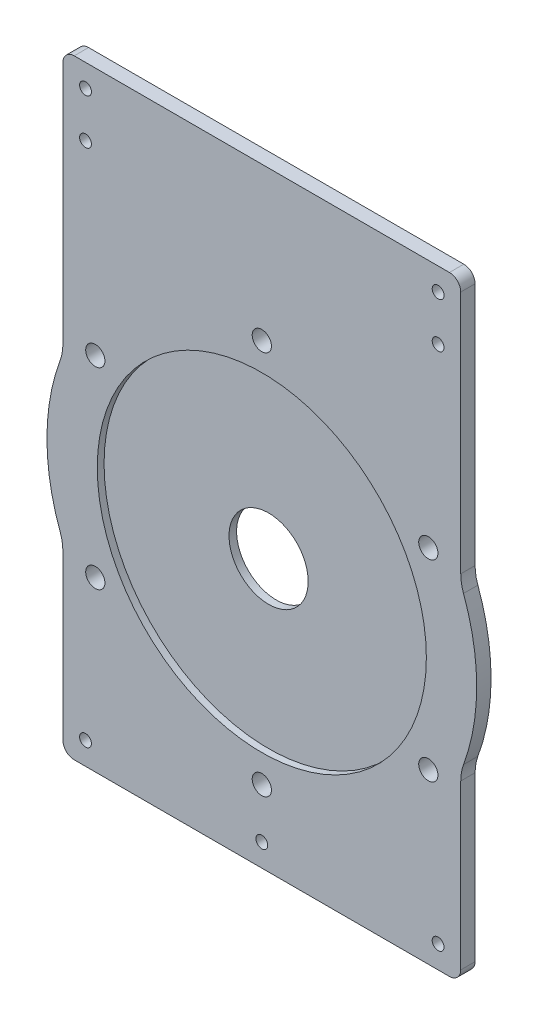
ISO-10303-21;
HEADER;
FILE_DESCRIPTION(('STEP AP214'),'2;1');
FILE_NAME('part.step','',(''),(''),'','','');
FILE_SCHEMA(('AUTOMOTIVE_DESIGN { 1 0 10303 214 1 1 1 1 }'));
ENDSEC;
DATA;
#1=APPLICATION_CONTEXT('core data for automotive mechanical design processes');
#2=APPLICATION_PROTOCOL_DEFINITION('international standard','automotive_design',2000,#1);
#3=PRODUCT_CONTEXT('',#1,'mechanical');
#4=PRODUCT('Part','Part','',(#3));
#5=PRODUCT_RELATED_PRODUCT_CATEGORY('part','',(#4));
#6=PRODUCT_DEFINITION_FORMATION('','',#4);
#7=PRODUCT_DEFINITION_CONTEXT('part definition',#1,'design');
#8=PRODUCT_DEFINITION('design','',#6,#7);
#9=PRODUCT_DEFINITION_SHAPE('','',#8);
#10=(LENGTH_UNIT() NAMED_UNIT(*) SI_UNIT(.MILLI.,.METRE.));
#11=(NAMED_UNIT(*) PLANE_ANGLE_UNIT() SI_UNIT($,.RADIAN.));
#12=(NAMED_UNIT(*) SI_UNIT($,.STERADIAN.) SOLID_ANGLE_UNIT());
#13=UNCERTAINTY_MEASURE_WITH_UNIT(LENGTH_MEASURE(1.E-05),#10,'distance_accuracy_value','');
#14=(GEOMETRIC_REPRESENTATION_CONTEXT(3) GLOBAL_UNCERTAINTY_ASSIGNED_CONTEXT((#13)) GLOBAL_UNIT_ASSIGNED_CONTEXT((#10,
#11,#12)) REPRESENTATION_CONTEXT('',''));
#15=CARTESIAN_POINT('',(0.,0.,0.));
#16=DIRECTION('',(0.,0.,1.));
#17=DIRECTION('',(1.,0.,0.));
#18=AXIS2_PLACEMENT_3D('',#15,#16,#17);
#19=CARTESIAN_POINT('',(0.,0.,6.35));
#20=DIRECTION('',(0.,0.,-1.));
#21=DIRECTION('',(-1.,0.,0.));
#22=AXIS2_PLACEMENT_3D('',#19,#20,#21);
#23=CYLINDRICAL_SURFACE('',#22,95.);
#24=CARTESIAN_POINT('',(0.,0.,6.35));
#25=DIRECTION('',(0.,0.,1.));
#26=DIRECTION('',(1.,0.,0.));
#27=AXIS2_PLACEMENT_3D('',#24,#25,#26);
#28=CIRCLE('',#27,95.);
#29=CARTESIAN_POINT('',(-89.1727826086956,32.759957903244,6.35));
#30=VERTEX_POINT('',#29);
#31=CARTESIAN_POINT('',(-89.1727826086956,-32.7599579032439,6.35));
#32=VERTEX_POINT('',#31);
#33=EDGE_CURVE('E238',#30,#32,#28,.T.);
#34=ORIENTED_EDGE('',*,*,#33,.F.);
#35=DIRECTION('',(0.,0.,-1.));
#36=VECTOR('',#35,1.);
#37=CARTESIAN_POINT('',(-89.1727826086956,32.759957903244,6.35));
#38=LINE('',#37,#36);
#39=CARTESIAN_POINT('',(-89.1727826086956,32.759957903244,0.));
#40=VERTEX_POINT('',#39);
#41=EDGE_CURVE('E234',#30,#40,#38,.T.);
#42=ORIENTED_EDGE('',*,*,#41,.T.);
#43=CARTESIAN_POINT('',(0.,0.,0.));
#44=DIRECTION('',(0.,0.,1.));
#45=DIRECTION('',(1.,0.,0.));
#46=AXIS2_PLACEMENT_3D('',#43,#44,#45);
#47=CIRCLE('',#46,95.);
#48=CARTESIAN_POINT('',(-89.1727826086956,-32.7599579032439,0.));
#49=VERTEX_POINT('',#48);
#50=EDGE_CURVE('E206',#40,#49,#47,.T.);
#51=ORIENTED_EDGE('',*,*,#50,.T.);
#52=DIRECTION('',(0.,0.,-1.));
#53=VECTOR('',#52,1.);
#54=CARTESIAN_POINT('',(-89.1727826086957,-32.7599579032439,6.35));
#55=LINE('',#54,#53);
#56=EDGE_CURVE('E227',#49,#32,#55,.F.);
#57=ORIENTED_EDGE('',*,*,#56,.T.);
#58=EDGE_LOOP('',(#34,#42,#51,#57));
#59=FACE_BOUND('',#58,.T.);
#60=ADVANCED_FACE('F59',(#59),#23,.T.);
#61=CARTESIAN_POINT('',(89.1727826086956,-32.7599579032439,6.35));
#62=VERTEX_POINT('',#61);
#63=CARTESIAN_POINT('',(89.1727826086957,32.7599579032439,6.35));
#64=VERTEX_POINT('',#63);
#65=EDGE_CURVE('E228',#62,#64,#28,.T.);
#66=ORIENTED_EDGE('',*,*,#65,.F.);
#67=DIRECTION('',(0.,0.,-1.));
#68=VECTOR('',#67,1.);
#69=CARTESIAN_POINT('',(89.1727826086957,-32.7599579032439,6.35));
#70=LINE('',#69,#68);
#71=CARTESIAN_POINT('',(89.1727826086956,-32.7599579032439,0.));
#72=VERTEX_POINT('',#71);
#73=EDGE_CURVE('E257',#62,#72,#70,.T.);
#74=ORIENTED_EDGE('',*,*,#73,.T.);
#75=CARTESIAN_POINT('',(89.1727826086957,32.7599579032439,0.));
#76=VERTEX_POINT('',#75);
#77=EDGE_CURVE('E241',#72,#76,#47,.T.);
#78=ORIENTED_EDGE('',*,*,#77,.T.);
#79=DIRECTION('',(0.,0.,-1.));
#80=VECTOR('',#79,1.);
#81=CARTESIAN_POINT('',(89.1727826086957,32.7599579032439,6.35));
#82=LINE('',#81,#80);
#83=EDGE_CURVE('E253',#76,#64,#82,.F.);
#84=ORIENTED_EDGE('',*,*,#83,.T.);
#85=EDGE_LOOP('',(#66,#74,#78,#84));
#86=FACE_BOUND('',#85,.T.);
#87=ADVANCED_FACE('F490',(#86),#23,.T.);
#88=CARTESIAN_POINT('',(0.,0.,6.35));
#89=DIRECTION('',(0.,0.,1.));
#90=DIRECTION('',(1.,0.,0.));
#91=AXIS2_PLACEMENT_3D('',#88,#89,#90);
#92=PLANE('',#91);
#93=CARTESIAN_POINT('',(77.9460000000001,142.5499,6.35));
#94=DIRECTION('',(0.,0.,1.));
#95=DIRECTION('',(-1.,0.,0.));
#96=AXIS2_PLACEMENT_3D('',#93,#94,#95);
#97=CIRCLE('',#96,2.61620000000001);
#98=CARTESIAN_POINT('',(75.3298000000001,142.5499,6.35));
#99=VERTEX_POINT('',#98);
#100=EDGE_CURVE('E550',#99,#99,#97,.T.);
#101=ORIENTED_EDGE('',*,*,#100,.F.);
#102=EDGE_LOOP('',(#101));
#103=FACE_BOUND('',#102,.T.);
#104=CARTESIAN_POINT('',(77.946,122.5499,6.35));
#105=DIRECTION('',(0.,0.,1.));
#106=DIRECTION('',(-1.,0.,0.));
#107=AXIS2_PLACEMENT_3D('',#104,#105,#106);
#108=CIRCLE('',#107,2.6162);
#109=CARTESIAN_POINT('',(75.3298,122.5499,6.35));
#110=VERTEX_POINT('',#109);
#111=EDGE_CURVE('E549',#110,#110,#108,.T.);
#112=ORIENTED_EDGE('',*,*,#111,.F.);
#113=EDGE_LOOP('',(#112));
#114=FACE_BOUND('',#113,.T.);
#115=CARTESIAN_POINT('',(-77.946,122.5499,6.35));
#116=DIRECTION('',(0.,0.,1.));
#117=DIRECTION('',(1.,0.,0.));
#118=AXIS2_PLACEMENT_3D('',#115,#116,#117);
#119=CIRCLE('',#118,2.6162);
#120=CARTESIAN_POINT('',(-75.3298,122.5499,6.35));
#121=VERTEX_POINT('',#120);
#122=EDGE_CURVE('E556',#121,#121,#119,.T.);
#123=ORIENTED_EDGE('',*,*,#122,.F.);
#124=EDGE_LOOP('',(#123));
#125=FACE_BOUND('',#124,.T.);
#126=CARTESIAN_POINT('',(-77.946,142.5499,6.35));
#127=DIRECTION('',(0.,0.,1.));
#128=DIRECTION('',(1.,0.,0.));
#129=AXIS2_PLACEMENT_3D('',#126,#127,#128);
#130=CIRCLE('',#129,2.61620000000001);
#131=CARTESIAN_POINT('',(-75.3297999999999,142.5499,6.35));
#132=VERTEX_POINT('',#131);
#133=EDGE_CURVE('E538',#132,#132,#130,.T.);
#134=ORIENTED_EDGE('',*,*,#133,.F.);
#135=EDGE_LOOP('',(#134));
#136=FACE_BOUND('',#135,.T.);
#137=CARTESIAN_POINT('',(-77.946,-107.,6.35));
#138=DIRECTION('',(0.,0.,1.));
#139=DIRECTION('',(1.,0.,0.));
#140=AXIS2_PLACEMENT_3D('',#137,#138,#139);
#141=CIRCLE('',#140,2.6162);
#142=CARTESIAN_POINT('',(-75.3298,-107.,6.35));
#143=VERTEX_POINT('',#142);
#144=EDGE_CURVE('E343',#143,#143,#141,.T.);
#145=ORIENTED_EDGE('',*,*,#144,.F.);
#146=EDGE_LOOP('',(#145));
#147=FACE_BOUND('',#146,.T.);
#148=CARTESIAN_POINT('',(0.,-107.,6.35));
#149=DIRECTION('',(0.,0.,1.));
#150=DIRECTION('',(1.,0.,0.));
#151=AXIS2_PLACEMENT_3D('',#148,#149,#150);
#152=CIRCLE('',#151,2.6162);
#153=CARTESIAN_POINT('',(2.61619999999997,-107.,6.35));
#154=VERTEX_POINT('',#153);
#155=EDGE_CURVE('E353',#154,#154,#152,.T.);
#156=ORIENTED_EDGE('',*,*,#155,.F.);
#157=EDGE_LOOP('',(#156));
#158=FACE_BOUND('',#157,.T.);
#159=CARTESIAN_POINT('',(77.9459999999999,-107.,6.35));
#160=DIRECTION('',(0.,0.,1.));
#161=DIRECTION('',(-1.,0.,0.));
#162=AXIS2_PLACEMENT_3D('',#159,#160,#161);
#163=CIRCLE('',#162,2.6162);
#164=CARTESIAN_POINT('',(75.3297999999999,-107.,6.35));
#165=VERTEX_POINT('',#164);
#166=EDGE_CURVE('E221',#165,#165,#163,.T.);
#167=ORIENTED_EDGE('',*,*,#166,.F.);
#168=EDGE_LOOP('',(#167));
#169=FACE_BOUND('',#168,.T.);
#170=CARTESIAN_POINT('',(0.,85.,6.35));
#171=DIRECTION('',(0.,0.,1.));
#172=DIRECTION('',(1.,0.,0.));
#173=AXIS2_PLACEMENT_3D('',#170,#171,#172);
#174=CIRCLE('',#173,4.25);
#175=CARTESIAN_POINT('',(4.25,85.,6.35));
#176=VERTEX_POINT('',#175);
#177=EDGE_CURVE('E352',#176,#176,#174,.T.);
#178=ORIENTED_EDGE('',*,*,#177,.F.);
#179=EDGE_LOOP('',(#178));
#180=FACE_BOUND('',#179,.T.);
#181=CARTESIAN_POINT('',(73.6121593216797,42.5000000000042,6.35));
#182=DIRECTION('',(0.,0.,1.));
#183=DIRECTION('',(1.,0.,0.));
#184=AXIS2_PLACEMENT_3D('',#181,#182,#183);
#185=CIRCLE('',#184,4.25);
#186=CARTESIAN_POINT('',(77.8621593216797,42.5000000000042,6.35));
#187=VERTEX_POINT('',#186);
#188=EDGE_CURVE('E372',#187,#187,#185,.T.);
#189=ORIENTED_EDGE('',*,*,#188,.F.);
#190=EDGE_LOOP('',(#189));
#191=FACE_BOUND('',#190,.T.);
#192=CARTESIAN_POINT('',(73.6121593216845,-42.4999999999958,6.35));
#193=DIRECTION('',(0.,0.,1.));
#194=DIRECTION('',(1.,0.,0.));
#195=AXIS2_PLACEMENT_3D('',#192,#193,#194);
#196=CIRCLE('',#195,4.25);
#197=CARTESIAN_POINT('',(77.8621593216845,-42.4999999999958,6.35));
#198=VERTEX_POINT('',#197);
#199=EDGE_CURVE('E380',#198,#198,#196,.T.);
#200=ORIENTED_EDGE('',*,*,#199,.F.);
#201=EDGE_LOOP('',(#200));
#202=FACE_BOUND('',#201,.T.);
#203=CARTESIAN_POINT('',(9.64256221075186E-12,-85.,6.35));
#204=DIRECTION('',(0.,0.,1.));
#205=DIRECTION('',(1.,0.,0.));
#206=AXIS2_PLACEMENT_3D('',#203,#204,#205);
#207=CIRCLE('',#206,4.25);
#208=CARTESIAN_POINT('',(4.25000000000964,-85.,6.35));
#209=VERTEX_POINT('',#208);
#210=EDGE_CURVE('E388',#209,#209,#207,.T.);
#211=ORIENTED_EDGE('',*,*,#210,.F.);
#212=EDGE_LOOP('',(#211));
#213=FACE_BOUND('',#212,.T.);
#214=CARTESIAN_POINT('',(-73.61215932167,-42.5000000000042,6.35));
#215=DIRECTION('',(0.,0.,1.));
#216=DIRECTION('',(1.,0.,0.));
#217=AXIS2_PLACEMENT_3D('',#214,#215,#216);
#218=CIRCLE('',#217,4.25);
#219=CARTESIAN_POINT('',(-69.36215932167,-42.5000000000042,6.35));
#220=VERTEX_POINT('',#219);
#221=EDGE_CURVE('E396',#220,#220,#218,.T.);
#222=ORIENTED_EDGE('',*,*,#221,.F.);
#223=EDGE_LOOP('',(#222));
#224=FACE_BOUND('',#223,.T.);
#225=CARTESIAN_POINT('',(-73.6121593216749,42.4999999999958,6.35));
#226=DIRECTION('',(0.,0.,1.));
#227=DIRECTION('',(1.,0.,0.));
#228=AXIS2_PLACEMENT_3D('',#225,#226,#227);
#229=CIRCLE('',#228,4.25);
#230=CARTESIAN_POINT('',(-69.3621593216749,42.4999999999958,6.35));
#231=VERTEX_POINT('',#230);
#232=EDGE_CURVE('E404',#231,#231,#229,.T.);
#233=ORIENTED_EDGE('',*,*,#232,.F.);
#234=EDGE_LOOP('',(#233));
#235=FACE_BOUND('',#234,.T.);
#236=CARTESIAN_POINT('',(0.,0.,6.35));
#237=DIRECTION('',(0.,0.,1.));
#238=DIRECTION('',(1.,0.,0.));
#239=AXIS2_PLACEMENT_3D('',#236,#237,#238);
#240=CIRCLE('',#239,72.75);
#241=CARTESIAN_POINT('',(72.75,0.,6.35));
#242=VERTEX_POINT('',#241);
#243=EDGE_CURVE('E418',#242,#242,#240,.T.);
#244=ORIENTED_EDGE('',*,*,#243,.F.);
#245=EDGE_LOOP('',(#244));
#246=FACE_BOUND('',#245,.T.);
#247=DIRECTION('',(0.,-1.,0.));
#248=VECTOR('',#247,1.);
#249=CARTESIAN_POINT('',(-87.946,-117.,6.35));
#250=LINE('',#249,#248);
#251=CARTESIAN_POINT('',(-87.946,-39.6567911460321,6.35));
#252=VERTEX_POINT('',#251);
#253=CARTESIAN_POINT('',(-87.946,-112.,6.35));
#254=VERTEX_POINT('',#253);
#255=EDGE_CURVE('E423',#252,#254,#250,.T.);
#256=ORIENTED_EDGE('',*,*,#255,.T.);
#257=CARTESIAN_POINT('',(-82.946,-112.,6.34999999999999));
#258=DIRECTION('',(0.,0.,1.));
#259=DIRECTION('',(1.,0.,0.));
#260=AXIS2_PLACEMENT_3D('',#257,#258,#259);
#261=CIRCLE('',#260,5.);
#262=CARTESIAN_POINT('',(-82.9459999999999,-117.,6.35));
#263=VERTEX_POINT('',#262);
#264=EDGE_CURVE('E294',#254,#263,#261,.T.);
#265=ORIENTED_EDGE('',*,*,#264,.T.);
#266=DIRECTION('',(1.,0.,0.));
#267=VECTOR('',#266,1.);
#268=CARTESIAN_POINT('',(87.946,-117.,6.35));
#269=LINE('',#268,#267);
#270=CARTESIAN_POINT('',(82.946,-117.,6.35));
#271=VERTEX_POINT('',#270);
#272=EDGE_CURVE('E438',#263,#271,#269,.T.);
#273=ORIENTED_EDGE('',*,*,#272,.T.);
#274=CARTESIAN_POINT('',(82.946,-112.,6.34999999999999));
#275=DIRECTION('',(0.,0.,1.));
#276=DIRECTION('',(1.,0.,0.));
#277=AXIS2_PLACEMENT_3D('',#274,#275,#276);
#278=CIRCLE('',#277,5.);
#279=CARTESIAN_POINT('',(87.946,-112.,6.35));
#280=VERTEX_POINT('',#279);
#281=EDGE_CURVE('E291',#271,#280,#278,.T.);
#282=ORIENTED_EDGE('',*,*,#281,.T.);
#283=DIRECTION('',(0.,1.,0.));
#284=VECTOR('',#283,1.);
#285=CARTESIAN_POINT('',(87.946,-117.,6.35));
#286=LINE('',#285,#284);
#287=CARTESIAN_POINT('',(87.946,-39.6567911460321,6.35));
#288=VERTEX_POINT('',#287);
#289=EDGE_CURVE('E432',#280,#288,#286,.T.);
#290=ORIENTED_EDGE('',*,*,#289,.T.);
#291=CARTESIAN_POINT('',(107.946,-39.6567911460321,6.35));
#292=DIRECTION('',(0.,0.,1.));
#293=DIRECTION('',(1.,0.,0.));
#294=AXIS2_PLACEMENT_3D('',#291,#292,#293);
#295=CIRCLE('',#294,20.);
#296=EDGE_CURVE('E270',#288,#62,#295,.F.);
#297=ORIENTED_EDGE('',*,*,#296,.T.);
#298=ORIENTED_EDGE('',*,*,#65,.T.);
#299=CARTESIAN_POINT('',(107.946,39.656791146032,6.35));
#300=DIRECTION('',(0.,0.,1.));
#301=DIRECTION('',(1.,0.,0.));
#302=AXIS2_PLACEMENT_3D('',#299,#300,#301);
#303=CIRCLE('',#302,20.);
#304=CARTESIAN_POINT('',(87.946,39.656791146032,6.35));
#305=VERTEX_POINT('',#304);
#306=EDGE_CURVE('E276',#64,#305,#303,.F.);
#307=ORIENTED_EDGE('',*,*,#306,.T.);
#308=DIRECTION('',(0.,1.,0.));
#309=VECTOR('',#308,1.);
#310=CARTESIAN_POINT('',(87.946,152.5499,6.35));
#311=LINE('',#310,#309);
#312=CARTESIAN_POINT('',(87.946,147.5499,6.35));
#313=VERTEX_POINT('',#312);
#314=EDGE_CURVE('E334',#305,#313,#311,.T.);
#315=ORIENTED_EDGE('',*,*,#314,.T.);
#316=CARTESIAN_POINT('',(82.946,147.5499,6.34999999999999));
#317=DIRECTION('',(0.,0.,1.));
#318=DIRECTION('',(1.,0.,0.));
#319=AXIS2_PLACEMENT_3D('',#316,#317,#318);
#320=CIRCLE('',#319,5.);
#321=CARTESIAN_POINT('',(82.946,152.5499,6.35));
#322=VERTEX_POINT('',#321);
#323=EDGE_CURVE('E289',#313,#322,#320,.T.);
#324=ORIENTED_EDGE('',*,*,#323,.T.);
#325=DIRECTION('',(-1.,0.,0.));
#326=VECTOR('',#325,1.);
#327=CARTESIAN_POINT('',(87.946,152.5499,6.35));
#328=LINE('',#327,#326);
#329=CARTESIAN_POINT('',(-82.9459999999999,152.5499,6.35));
#330=VERTEX_POINT('',#329);
#331=EDGE_CURVE('E327',#322,#330,#328,.T.);
#332=ORIENTED_EDGE('',*,*,#331,.T.);
#333=CARTESIAN_POINT('',(-82.9459999999999,147.5499,6.34999999999999));
#334=DIRECTION('',(0.,0.,1.));
#335=DIRECTION('',(1.,0.,0.));
#336=AXIS2_PLACEMENT_3D('',#333,#334,#335);
#337=CIRCLE('',#336,5.);
#338=CARTESIAN_POINT('',(-87.946,147.5499,6.35));
#339=VERTEX_POINT('',#338);
#340=EDGE_CURVE('E286',#330,#339,#337,.T.);
#341=ORIENTED_EDGE('',*,*,#340,.T.);
#342=DIRECTION('',(0.,-1.,0.));
#343=VECTOR('',#342,1.);
#344=CARTESIAN_POINT('',(-87.946,152.5499,6.35));
#345=LINE('',#344,#343);
#346=CARTESIAN_POINT('',(-87.9459999999999,39.6567911460323,6.35));
#347=VERTEX_POINT('',#346);
#348=EDGE_CURVE('E339',#339,#347,#345,.T.);
#349=ORIENTED_EDGE('',*,*,#348,.T.);
#350=CARTESIAN_POINT('',(-107.946,39.6567911460322,6.35));
#351=DIRECTION('',(0.,0.,1.));
#352=DIRECTION('',(1.,0.,0.));
#353=AXIS2_PLACEMENT_3D('',#350,#351,#352);
#354=CIRCLE('',#353,20.);
#355=EDGE_CURVE('E212',#347,#30,#354,.F.);
#356=ORIENTED_EDGE('',*,*,#355,.T.);
#357=ORIENTED_EDGE('',*,*,#33,.T.);
#358=CARTESIAN_POINT('',(-107.946,-39.6567911460321,6.35));
#359=DIRECTION('',(0.,0.,1.));
#360=DIRECTION('',(1.,0.,0.));
#361=AXIS2_PLACEMENT_3D('',#358,#359,#360);
#362=CIRCLE('',#361,20.);
#363=EDGE_CURVE('E211',#32,#252,#362,.F.);
#364=ORIENTED_EDGE('',*,*,#363,.T.);
#365=EDGE_LOOP('',(#256,#265,#273,#282,#290,#297,#298,#307,#315,#324,#332,#341,#349,#356,#357,#364));
#366=FACE_BOUND('',#365,.T.);
#367=ADVANCED_FACE('F331',(#103,#114,#125,#136,#147,#158,#169,#180,#191,#202,#213,#224,#235,
#246,#366),#92,.T.);
#368=CARTESIAN_POINT('',(0.,0.,0.));
#369=DIRECTION('',(0.,0.,1.));
#370=DIRECTION('',(1.,0.,0.));
#371=AXIS2_PLACEMENT_3D('',#368,#369,#370);
#372=PLANE('',#371);
#373=CARTESIAN_POINT('',(77.9460000000001,142.5499,0.));
#374=DIRECTION('',(0.,0.,1.));
#375=DIRECTION('',(1.,0.,0.));
#376=AXIS2_PLACEMENT_3D('',#373,#374,#375);
#377=CIRCLE('',#376,2.61620000000001);
#378=CARTESIAN_POINT('',(80.5622000000001,142.5499,0.));
#379=VERTEX_POINT('',#378);
#380=EDGE_CURVE('E546',#379,#379,#377,.F.);
#381=ORIENTED_EDGE('',*,*,#380,.F.);
#382=EDGE_LOOP('',(#381));
#383=FACE_BOUND('',#382,.T.);
#384=CARTESIAN_POINT('',(77.946,122.5499,0.));
#385=DIRECTION('',(0.,0.,1.));
#386=DIRECTION('',(1.,0.,0.));
#387=AXIS2_PLACEMENT_3D('',#384,#385,#386);
#388=CIRCLE('',#387,2.6162);
#389=CARTESIAN_POINT('',(80.5622,122.5499,0.));
#390=VERTEX_POINT('',#389);
#391=EDGE_CURVE('E553',#390,#390,#388,.F.);
#392=ORIENTED_EDGE('',*,*,#391,.F.);
#393=EDGE_LOOP('',(#392));
#394=FACE_BOUND('',#393,.T.);
#395=CARTESIAN_POINT('',(-77.946,122.5499,0.));
#396=DIRECTION('',(0.,0.,1.));
#397=DIRECTION('',(1.,0.,0.));
#398=AXIS2_PLACEMENT_3D('',#395,#396,#397);
#399=CIRCLE('',#398,2.6162);
#400=CARTESIAN_POINT('',(-75.3298,122.5499,0.));
#401=VERTEX_POINT('',#400);
#402=EDGE_CURVE('E543',#401,#401,#399,.F.);
#403=ORIENTED_EDGE('',*,*,#402,.F.);
#404=EDGE_LOOP('',(#403));
#405=FACE_BOUND('',#404,.T.);
#406=CARTESIAN_POINT('',(-77.946,142.5499,0.));
#407=DIRECTION('',(0.,0.,1.));
#408=DIRECTION('',(1.,0.,0.));
#409=AXIS2_PLACEMENT_3D('',#406,#407,#408);
#410=CIRCLE('',#409,2.61620000000001);
#411=CARTESIAN_POINT('',(-75.3297999999999,142.5499,0.));
#412=VERTEX_POINT('',#411);
#413=EDGE_CURVE('E534',#412,#412,#410,.F.);
#414=ORIENTED_EDGE('',*,*,#413,.F.);
#415=EDGE_LOOP('',(#414));
#416=FACE_BOUND('',#415,.T.);
#417=CARTESIAN_POINT('',(-77.946,-107.,0.));
#418=DIRECTION('',(0.,0.,1.));
#419=DIRECTION('',(1.,0.,0.));
#420=AXIS2_PLACEMENT_3D('',#417,#418,#419);
#421=CIRCLE('',#420,2.6162);
#422=CARTESIAN_POINT('',(-75.3298,-107.,0.));
#423=VERTEX_POINT('',#422);
#424=EDGE_CURVE('E347',#423,#423,#421,.F.);
#425=ORIENTED_EDGE('',*,*,#424,.F.);
#426=EDGE_LOOP('',(#425));
#427=FACE_BOUND('',#426,.T.);
#428=CARTESIAN_POINT('',(0.,-107.,0.));
#429=DIRECTION('',(0.,0.,1.));
#430=DIRECTION('',(1.,0.,0.));
#431=AXIS2_PLACEMENT_3D('',#428,#429,#430);
#432=CIRCLE('',#431,2.6162);
#433=CARTESIAN_POINT('',(2.61619999999997,-107.,0.));
#434=VERTEX_POINT('',#433);
#435=EDGE_CURVE('E348',#434,#434,#432,.F.);
#436=ORIENTED_EDGE('',*,*,#435,.F.);
#437=EDGE_LOOP('',(#436));
#438=FACE_BOUND('',#437,.T.);
#439=CARTESIAN_POINT('',(77.9459999999999,-107.,0.));
#440=DIRECTION('',(0.,0.,1.));
#441=DIRECTION('',(1.,0.,0.));
#442=AXIS2_PLACEMENT_3D('',#439,#440,#441);
#443=CIRCLE('',#442,2.6162);
#444=CARTESIAN_POINT('',(80.5621999999999,-107.,0.));
#445=VERTEX_POINT('',#444);
#446=EDGE_CURVE('E357',#445,#445,#443,.F.);
#447=ORIENTED_EDGE('',*,*,#446,.F.);
#448=EDGE_LOOP('',(#447));
#449=FACE_BOUND('',#448,.T.);
#450=CARTESIAN_POINT('',(0.,85.,0.));
#451=DIRECTION('',(0.,0.,1.));
#452=DIRECTION('',(1.,0.,0.));
#453=AXIS2_PLACEMENT_3D('',#450,#451,#452);
#454=CIRCLE('',#453,4.25);
#455=CARTESIAN_POINT('',(4.25,85.,0.));
#456=VERTEX_POINT('',#455);
#457=EDGE_CURVE('E369',#456,#456,#454,.T.);
#458=ORIENTED_EDGE('',*,*,#457,.T.);
#459=EDGE_LOOP('',(#458));
#460=FACE_BOUND('',#459,.T.);
#461=CARTESIAN_POINT('',(73.6121593216797,42.5000000000042,0.));
#462=DIRECTION('',(0.,0.,1.));
#463=DIRECTION('',(1.,0.,0.));
#464=AXIS2_PLACEMENT_3D('',#461,#462,#463);
#465=CIRCLE('',#464,4.25);
#466=CARTESIAN_POINT('',(77.8621593216797,42.5000000000042,0.));
#467=VERTEX_POINT('',#466);
#468=EDGE_CURVE('E376',#467,#467,#465,.T.);
#469=ORIENTED_EDGE('',*,*,#468,.T.);
#470=EDGE_LOOP('',(#469));
#471=FACE_BOUND('',#470,.T.);
#472=CARTESIAN_POINT('',(73.6121593216845,-42.4999999999958,0.));
#473=DIRECTION('',(0.,0.,1.));
#474=DIRECTION('',(1.,0.,0.));
#475=AXIS2_PLACEMENT_3D('',#472,#473,#474);
#476=CIRCLE('',#475,4.25);
#477=CARTESIAN_POINT('',(77.8621593216845,-42.4999999999958,0.));
#478=VERTEX_POINT('',#477);
#479=EDGE_CURVE('E384',#478,#478,#476,.T.);
#480=ORIENTED_EDGE('',*,*,#479,.T.);
#481=EDGE_LOOP('',(#480));
#482=FACE_BOUND('',#481,.T.);
#483=CARTESIAN_POINT('',(9.64256221075186E-12,-85.,0.));
#484=DIRECTION('',(0.,0.,1.));
#485=DIRECTION('',(1.,0.,0.));
#486=AXIS2_PLACEMENT_3D('',#483,#484,#485);
#487=CIRCLE('',#486,4.25);
#488=CARTESIAN_POINT('',(4.25000000000964,-85.,0.));
#489=VERTEX_POINT('',#488);
#490=EDGE_CURVE('E392',#489,#489,#487,.T.);
#491=ORIENTED_EDGE('',*,*,#490,.T.);
#492=EDGE_LOOP('',(#491));
#493=FACE_BOUND('',#492,.T.);
#494=CARTESIAN_POINT('',(-73.61215932167,-42.5000000000042,0.));
#495=DIRECTION('',(0.,0.,1.));
#496=DIRECTION('',(1.,0.,0.));
#497=AXIS2_PLACEMENT_3D('',#494,#495,#496);
#498=CIRCLE('',#497,4.25);
#499=CARTESIAN_POINT('',(-69.36215932167,-42.5000000000042,0.));
#500=VERTEX_POINT('',#499);
#501=EDGE_CURVE('E400',#500,#500,#498,.T.);
#502=ORIENTED_EDGE('',*,*,#501,.T.);
#503=EDGE_LOOP('',(#502));
#504=FACE_BOUND('',#503,.T.);
#505=CARTESIAN_POINT('',(-73.6121593216749,42.4999999999958,0.));
#506=DIRECTION('',(0.,0.,1.));
#507=DIRECTION('',(1.,0.,0.));
#508=AXIS2_PLACEMENT_3D('',#505,#506,#507);
#509=CIRCLE('',#508,4.25);
#510=CARTESIAN_POINT('',(-69.3621593216749,42.4999999999958,0.));
#511=VERTEX_POINT('',#510);
#512=EDGE_CURVE('E407',#511,#511,#509,.T.);
#513=ORIENTED_EDGE('',*,*,#512,.T.);
#514=EDGE_LOOP('',(#513));
#515=FACE_BOUND('',#514,.T.);
#516=CARTESIAN_POINT('',(0.,0.,0.));
#517=DIRECTION('',(0.,0.,1.));
#518=DIRECTION('',(1.,0.,0.));
#519=AXIS2_PLACEMENT_3D('',#516,#517,#518);
#520=CIRCLE('',#519,17.5);
#521=CARTESIAN_POINT('',(17.5,0.,0.));
#522=VERTEX_POINT('',#521);
#523=EDGE_CURVE('E414',#522,#522,#520,.F.);
#524=ORIENTED_EDGE('',*,*,#523,.F.);
#525=EDGE_LOOP('',(#524));
#526=FACE_BOUND('',#525,.T.);
#527=DIRECTION('',(-1.,0.,0.));
#528=VECTOR('',#527,1.);
#529=CARTESIAN_POINT('',(87.946,-117.,0.));
#530=LINE('',#529,#528);
#531=CARTESIAN_POINT('',(82.946,-117.,0.));
#532=VERTEX_POINT('',#531);
#533=CARTESIAN_POINT('',(-82.946,-117.,0.));
#534=VERTEX_POINT('',#533);
#535=EDGE_CURVE('E435',#532,#534,#530,.T.);
#536=ORIENTED_EDGE('',*,*,#535,.T.);
#537=CARTESIAN_POINT('',(-82.946,-112.,0.));
#538=DIRECTION('',(0.,0.,1.));
#539=DIRECTION('',(1.,0.,0.));
#540=AXIS2_PLACEMENT_3D('',#537,#538,#539);
#541=CIRCLE('',#540,5.);
#542=CARTESIAN_POINT('',(-87.946,-112.,0.));
#543=VERTEX_POINT('',#542);
#544=EDGE_CURVE('E310',#534,#543,#541,.F.);
#545=ORIENTED_EDGE('',*,*,#544,.T.);
#546=DIRECTION('',(0.,1.,0.));
#547=VECTOR('',#546,1.);
#548=CARTESIAN_POINT('',(-87.946,-117.,0.));
#549=LINE('',#548,#547);
#550=CARTESIAN_POINT('',(-87.946,-39.6567911460321,0.));
#551=VERTEX_POINT('',#550);
#552=EDGE_CURVE('E431',#543,#551,#549,.T.);
#553=ORIENTED_EDGE('',*,*,#552,.T.);
#554=CARTESIAN_POINT('',(-107.946,-39.6567911460321,0.));
#555=DIRECTION('',(0.,0.,1.));
#556=DIRECTION('',(1.,0.,0.));
#557=AXIS2_PLACEMENT_3D('',#554,#555,#556);
#558=CIRCLE('',#557,20.);
#559=EDGE_CURVE('E267',#551,#49,#558,.T.);
#560=ORIENTED_EDGE('',*,*,#559,.T.);
#561=ORIENTED_EDGE('',*,*,#50,.F.);
#562=CARTESIAN_POINT('',(-107.946,39.6567911460322,0.));
#563=DIRECTION('',(0.,0.,1.));
#564=DIRECTION('',(1.,0.,0.));
#565=AXIS2_PLACEMENT_3D('',#562,#563,#564);
#566=CIRCLE('',#565,20.);
#567=CARTESIAN_POINT('',(-87.9459999999999,39.6567911460322,0.));
#568=VERTEX_POINT('',#567);
#569=EDGE_CURVE('E199',#40,#568,#566,.T.);
#570=ORIENTED_EDGE('',*,*,#569,.T.);
#571=DIRECTION('',(0.,1.,0.));
#572=VECTOR('',#571,1.);
#573=CARTESIAN_POINT('',(-87.946,152.5499,0.));
#574=LINE('',#573,#572);
#575=CARTESIAN_POINT('',(-87.946,147.5499,0.));
#576=VERTEX_POINT('',#575);
#577=EDGE_CURVE('E203',#568,#576,#574,.T.);
#578=ORIENTED_EDGE('',*,*,#577,.T.);
#579=CARTESIAN_POINT('',(-82.9459999999999,147.5499,0.));
#580=DIRECTION('',(0.,0.,1.));
#581=DIRECTION('',(1.,0.,0.));
#582=AXIS2_PLACEMENT_3D('',#579,#580,#581);
#583=CIRCLE('',#582,5.);
#584=CARTESIAN_POINT('',(-82.9459999999999,152.5499,0.));
#585=VERTEX_POINT('',#584);
#586=EDGE_CURVE('E304',#576,#585,#583,.F.);
#587=ORIENTED_EDGE('',*,*,#586,.T.);
#588=DIRECTION('',(1.,0.,0.));
#589=VECTOR('',#588,1.);
#590=CARTESIAN_POINT('',(87.946,152.5499,0.));
#591=LINE('',#590,#589);
#592=CARTESIAN_POINT('',(82.946,152.5499,0.));
#593=VERTEX_POINT('',#592);
#594=EDGE_CURVE('E222',#585,#593,#591,.T.);
#595=ORIENTED_EDGE('',*,*,#594,.T.);
#596=CARTESIAN_POINT('',(82.946,147.5499,0.));
#597=DIRECTION('',(0.,0.,1.));
#598=DIRECTION('',(1.,0.,0.));
#599=AXIS2_PLACEMENT_3D('',#596,#597,#598);
#600=CIRCLE('',#599,5.);
#601=CARTESIAN_POINT('',(87.946,147.5499,0.));
#602=VERTEX_POINT('',#601);
#603=EDGE_CURVE('E75',#593,#602,#600,.F.);
#604=ORIENTED_EDGE('',*,*,#603,.T.);
#605=DIRECTION('',(0.,-1.,0.));
#606=VECTOR('',#605,1.);
#607=CARTESIAN_POINT('',(87.946,152.5499,0.));
#608=LINE('',#607,#606);
#609=CARTESIAN_POINT('',(87.946,39.656791146032,0.));
#610=VERTEX_POINT('',#609);
#611=EDGE_CURVE('E333',#602,#610,#608,.T.);
#612=ORIENTED_EDGE('',*,*,#611,.T.);
#613=CARTESIAN_POINT('',(107.946,39.656791146032,0.));
#614=DIRECTION('',(0.,0.,1.));
#615=DIRECTION('',(1.,0.,0.));
#616=AXIS2_PLACEMENT_3D('',#613,#614,#615);
#617=CIRCLE('',#616,20.);
#618=EDGE_CURVE('E279',#610,#76,#617,.T.);
#619=ORIENTED_EDGE('',*,*,#618,.T.);
#620=ORIENTED_EDGE('',*,*,#77,.F.);
#621=CARTESIAN_POINT('',(107.946,-39.6567911460321,0.));
#622=DIRECTION('',(0.,0.,1.));
#623=DIRECTION('',(1.,0.,0.));
#624=AXIS2_PLACEMENT_3D('',#621,#622,#623);
#625=CIRCLE('',#624,20.);
#626=CARTESIAN_POINT('',(87.946,-39.6567911460321,0.));
#627=VERTEX_POINT('',#626);
#628=EDGE_CURVE('E273',#72,#627,#625,.T.);
#629=ORIENTED_EDGE('',*,*,#628,.T.);
#630=DIRECTION('',(0.,-1.,0.));
#631=VECTOR('',#630,1.);
#632=CARTESIAN_POINT('',(87.946,-117.,0.));
#633=LINE('',#632,#631);
#634=CARTESIAN_POINT('',(87.946,-112.,0.));
#635=VERTEX_POINT('',#634);
#636=EDGE_CURVE('E427',#627,#635,#633,.T.);
#637=ORIENTED_EDGE('',*,*,#636,.T.);
#638=CARTESIAN_POINT('',(82.946,-112.,0.));
#639=DIRECTION('',(0.,0.,1.));
#640=DIRECTION('',(1.,0.,0.));
#641=AXIS2_PLACEMENT_3D('',#638,#639,#640);
#642=CIRCLE('',#641,5.);
#643=EDGE_CURVE('E307',#635,#532,#642,.F.);
#644=ORIENTED_EDGE('',*,*,#643,.T.);
#645=EDGE_LOOP('',(#536,#545,#553,#560,#561,#570,#578,#587,#595,#604,#612,#619,#620,#629,#637,#644));
#646=FACE_BOUND('',#645,.T.);
#647=ADVANCED_FACE('F202',(#383,#394,#405,#416,#427,#438,#449,#460,#471,#482,#493,#504,#515,
#526,#646),#372,.F.);
#648=CARTESIAN_POINT('',(-87.946,-117.,-193.678566760631));
#649=DIRECTION('',(-1.,0.,0.));
#650=DIRECTION('',(0.,0.,1.));
#651=AXIS2_PLACEMENT_3D('',#648,#649,#650);
#652=PLANE('',#651);
#653=ORIENTED_EDGE('',*,*,#552,.F.);
#654=DIRECTION('',(0.,0.,1.));
#655=VECTOR('',#654,1.);
#656=CARTESIAN_POINT('',(-87.946,-112.,-193.678566760631));
#657=LINE('',#656,#655);
#658=EDGE_CURVE('E282',#543,#254,#657,.T.);
#659=ORIENTED_EDGE('',*,*,#658,.T.);
#660=ORIENTED_EDGE('',*,*,#255,.F.);
#661=DIRECTION('',(0.,0.,-1.));
#662=VECTOR('',#661,1.);
#663=CARTESIAN_POINT('',(-87.946,-39.6567911460321,-193.678566760631));
#664=LINE('',#663,#662);
#665=EDGE_CURVE('E245',#252,#551,#664,.T.);
#666=ORIENTED_EDGE('',*,*,#665,.T.);
#667=EDGE_LOOP('',(#653,#659,#660,#666));
#668=FACE_BOUND('',#667,.T.);
#669=ADVANCED_FACE('F466',(#668),#652,.T.);
#670=CARTESIAN_POINT('',(87.946,-117.,-193.678566760631));
#671=DIRECTION('',(1.,0.,0.));
#672=DIRECTION('',(0.,0.,-1.));
#673=AXIS2_PLACEMENT_3D('',#670,#671,#672);
#674=PLANE('',#673);
#675=ORIENTED_EDGE('',*,*,#289,.F.);
#676=DIRECTION('',(0.,0.,1.));
#677=VECTOR('',#676,1.);
#678=CARTESIAN_POINT('',(87.946,-112.,-193.678566760631));
#679=LINE('',#678,#677);
#680=EDGE_CURVE('E313',#280,#635,#679,.F.);
#681=ORIENTED_EDGE('',*,*,#680,.T.);
#682=ORIENTED_EDGE('',*,*,#636,.F.);
#683=DIRECTION('',(0.,0.,-1.));
#684=VECTOR('',#683,1.);
#685=CARTESIAN_POINT('',(87.946,-39.6567911460321,-193.678566760631));
#686=LINE('',#685,#684);
#687=EDGE_CURVE('E249',#627,#288,#686,.F.);
#688=ORIENTED_EDGE('',*,*,#687,.T.);
#689=EDGE_LOOP('',(#675,#681,#682,#688));
#690=FACE_BOUND('',#689,.T.);
#691=ADVANCED_FACE('F515',(#690),#674,.T.);
#692=CARTESIAN_POINT('',(87.946,-117.,-193.678566760631));
#693=DIRECTION('',(0.,-1.,0.));
#694=DIRECTION('',(0.,0.,-1.));
#695=AXIS2_PLACEMENT_3D('',#692,#693,#694);
#696=PLANE('',#695);
#697=ORIENTED_EDGE('',*,*,#272,.F.);
#698=DIRECTION('',(0.,0.,1.));
#699=VECTOR('',#698,1.);
#700=CARTESIAN_POINT('',(-82.946,-117.,-193.678566760631));
#701=LINE('',#700,#699);
#702=EDGE_CURVE('E301',#263,#534,#701,.F.);
#703=ORIENTED_EDGE('',*,*,#702,.T.);
#704=ORIENTED_EDGE('',*,*,#535,.F.);
#705=DIRECTION('',(0.,0.,1.));
#706=VECTOR('',#705,1.);
#707=CARTESIAN_POINT('',(82.946,-117.,-193.678566760631));
#708=LINE('',#707,#706);
#709=EDGE_CURVE('E297',#532,#271,#708,.T.);
#710=ORIENTED_EDGE('',*,*,#709,.T.);
#711=EDGE_LOOP('',(#697,#703,#704,#710));
#712=FACE_BOUND('',#711,.T.);
#713=ADVANCED_FACE('F472',(#712),#696,.T.);
#714=CARTESIAN_POINT('',(0.,0.,3.35));
#715=DIRECTION('',(0.,0.,1.));
#716=DIRECTION('',(1.,0.,0.));
#717=AXIS2_PLACEMENT_3D('',#714,#715,#716);
#718=CYLINDRICAL_SURFACE('',#717,72.75);
#719=CARTESIAN_POINT('',(0.,0.,3.35));
#720=DIRECTION('',(0.,0.,1.));
#721=DIRECTION('',(1.,0.,0.));
#722=AXIS2_PLACEMENT_3D('',#719,#720,#721);
#723=CIRCLE('',#722,72.75);
#724=CARTESIAN_POINT('',(72.75,0.,3.35));
#725=VERTEX_POINT('',#724);
#726=EDGE_CURVE('E419',#725,#725,#723,.T.);
#727=ORIENTED_EDGE('',*,*,#726,.F.);
#728=EDGE_LOOP('',(#727));
#729=FACE_BOUND('',#728,.T.);
#730=ORIENTED_EDGE('',*,*,#243,.T.);
#731=EDGE_LOOP('',(#730));
#732=FACE_BOUND('',#731,.T.);
#733=ADVANCED_FACE('F592',(#729,#732),#718,.F.);
#734=CARTESIAN_POINT('',(0.,0.,3.35));
#735=DIRECTION('',(0.,0.,1.));
#736=DIRECTION('',(1.,0.,0.));
#737=AXIS2_PLACEMENT_3D('',#734,#735,#736);
#738=PLANE('',#737);
#739=CARTESIAN_POINT('',(0.,0.,3.35));
#740=DIRECTION('',(0.,0.,1.));
#741=DIRECTION('',(1.,0.,0.));
#742=AXIS2_PLACEMENT_3D('',#739,#740,#741);
#743=CIRCLE('',#742,17.5);
#744=CARTESIAN_POINT('',(17.5,0.,3.35));
#745=VERTEX_POINT('',#744);
#746=EDGE_CURVE('E411',#745,#745,#743,.T.);
#747=ORIENTED_EDGE('',*,*,#746,.F.);
#748=EDGE_LOOP('',(#747));
#749=FACE_BOUND('',#748,.T.);
#750=ORIENTED_EDGE('',*,*,#726,.T.);
#751=EDGE_LOOP('',(#750));
#752=FACE_BOUND('',#751,.T.);
#753=ADVANCED_FACE('F594',(#749,#752),#738,.T.);
#754=CARTESIAN_POINT('',(0.,0.,-0.00100000000000013));
#755=DIRECTION('',(0.,0.,1.));
#756=DIRECTION('',(1.,0.,0.));
#757=AXIS2_PLACEMENT_3D('',#754,#755,#756);
#758=CYLINDRICAL_SURFACE('',#757,17.5);
#759=CARTESIAN_POINT('',(17.5,0.,3.35));
#760=CARTESIAN_POINT('',(17.5,0.,3.31510416666667));
#761=CARTESIAN_POINT('',(17.5,0.,3.28020833333333));
#762=CARTESIAN_POINT('',(17.5,0.,3.21041666666667));
#763=CARTESIAN_POINT('',(17.5,0.,3.17552083333333));
#764=CARTESIAN_POINT('',(17.5,0.,3.10572916666667));
#765=CARTESIAN_POINT('',(17.5,0.,3.07083333333333));
#766=CARTESIAN_POINT('',(17.5,0.,3.00104166666667));
#767=CARTESIAN_POINT('',(17.5,0.,2.96614583333333));
#768=CARTESIAN_POINT('',(17.5,0.,2.89635416666667));
#769=CARTESIAN_POINT('',(17.5,0.,2.86145833333333));
#770=CARTESIAN_POINT('',(17.5,0.,2.79166666666667));
#771=CARTESIAN_POINT('',(17.5,0.,2.75677083333333));
#772=CARTESIAN_POINT('',(17.5,0.,2.68697916666667));
#773=CARTESIAN_POINT('',(17.5,0.,2.65208333333333));
#774=CARTESIAN_POINT('',(17.5,0.,2.58229166666667));
#775=CARTESIAN_POINT('',(17.5,0.,2.54739583333333));
#776=CARTESIAN_POINT('',(17.5,0.,2.47760416666667));
#777=CARTESIAN_POINT('',(17.5,0.,2.44270833333333));
#778=CARTESIAN_POINT('',(17.5,0.,2.37291666666667));
#779=CARTESIAN_POINT('',(17.5,0.,2.33802083333333));
#780=CARTESIAN_POINT('',(17.5,0.,2.26822916666667));
#781=CARTESIAN_POINT('',(17.5,0.,2.23333333333333));
#782=CARTESIAN_POINT('',(17.5,0.,2.16354166666667));
#783=CARTESIAN_POINT('',(17.5,0.,2.12864583333333));
#784=CARTESIAN_POINT('',(17.5,0.,2.05885416666667));
#785=CARTESIAN_POINT('',(17.5,0.,2.02395833333333));
#786=CARTESIAN_POINT('',(17.5,0.,1.95416666666667));
#787=CARTESIAN_POINT('',(17.5,0.,1.91927083333333));
#788=CARTESIAN_POINT('',(17.5,0.,1.84947916666667));
#789=CARTESIAN_POINT('',(17.5,0.,1.81458333333333));
#790=CARTESIAN_POINT('',(17.5,0.,1.74479166666667));
#791=CARTESIAN_POINT('',(17.5,0.,1.70989583333333));
#792=CARTESIAN_POINT('',(17.5,0.,1.64010416666667));
#793=CARTESIAN_POINT('',(17.5,0.,1.60520833333333));
#794=CARTESIAN_POINT('',(17.5,0.,1.53541666666667));
#795=CARTESIAN_POINT('',(17.5,0.,1.50052083333333));
#796=CARTESIAN_POINT('',(17.5,0.,1.43072916666667));
#797=CARTESIAN_POINT('',(17.5,0.,1.39583333333333));
#798=CARTESIAN_POINT('',(17.5,0.,1.32604166666667));
#799=CARTESIAN_POINT('',(17.5,0.,1.29114583333333));
#800=CARTESIAN_POINT('',(17.5,0.,1.22135416666667));
#801=CARTESIAN_POINT('',(17.5,0.,1.18645833333333));
#802=CARTESIAN_POINT('',(17.5,0.,1.11666666666667));
#803=CARTESIAN_POINT('',(17.5,0.,1.08177083333333));
#804=CARTESIAN_POINT('',(17.5,0.,1.01197916666667));
#805=CARTESIAN_POINT('',(17.5,0.,0.977083333333333));
#806=CARTESIAN_POINT('',(17.5,0.,0.907291666666666));
#807=CARTESIAN_POINT('',(17.5,0.,0.872395833333333));
#808=CARTESIAN_POINT('',(17.5,0.,0.802604166666666));
#809=CARTESIAN_POINT('',(17.5,0.,0.767708333333333));
#810=CARTESIAN_POINT('',(17.5,0.,0.697916666666666));
#811=CARTESIAN_POINT('',(17.5,0.,0.663020833333333));
#812=CARTESIAN_POINT('',(17.5,0.,0.593229166666666));
#813=CARTESIAN_POINT('',(17.5,0.,0.558333333333333));
#814=CARTESIAN_POINT('',(17.5,0.,0.488541666666667));
#815=CARTESIAN_POINT('',(17.5,0.,0.453645833333333));
#816=CARTESIAN_POINT('',(17.5,0.,0.383854166666667));
#817=CARTESIAN_POINT('',(17.5,0.,0.348958333333333));
#818=CARTESIAN_POINT('',(17.5,0.,0.279166666666667));
#819=CARTESIAN_POINT('',(17.5,0.,0.244270833333333));
#820=CARTESIAN_POINT('',(17.5,0.,0.174479166666667));
#821=CARTESIAN_POINT('',(17.5,0.,0.139583333333333));
#822=CARTESIAN_POINT('',(17.5,0.,0.0697916666666668));
#823=CARTESIAN_POINT('',(17.5,0.,0.0348958333333334));
#824=CARTESIAN_POINT('',(17.5,0.,0.));
#825=B_SPLINE_CURVE_WITH_KNOTS('',3,(#759,#760,#761,#762,#763,#764,#765,#766,#767,#768,#769,
#770,#771,#772,#773,#774,#775,#776,#777,#778,#779,#780,#781,#782,#783,#784,#785,#786,#787,#788,
#789,#790,#791,#792,#793,#794,#795,#796,#797,#798,#799,#800,#801,#802,#803,#804,#805,#806,#807,
#808,#809,#810,#811,#812,#813,#814,#815,#816,#817,#818,#819,#820,#821,#822,#823,#824),
.UNSPECIFIED.,.F.,.F.,(4,2,2,2,2,2,2,2,2,2,2,2,2,2,2,2,2,2,2,2,2,2,2,2,2,2,2,2,2,2,2,2,4),(0.,
0.1046875,0.209375,0.3140625,0.41875,0.5234375,0.628125,0.7328125,0.8375,0.9421875,1.046875,
1.1515625,1.25625,1.3609375,1.465625,1.5703125,1.675,1.7796875,1.884375,1.9890625,2.09375,
2.1984375,2.303125,2.4078125,2.5125,2.6171875,2.721875,2.8265625,2.93125,3.0359375,3.140625,
3.2453125,3.35),.UNSPECIFIED.);
#826=EDGE_CURVE('BSEAM601',#745,#522,#825,.T.);
#827=ORIENTED_EDGE('',*,*,#746,.T.);
#828=ORIENTED_EDGE('',*,*,#523,.T.);
#829=ORIENTED_EDGE('',*,*,#826,.T.);
#830=ORIENTED_EDGE('',*,*,#826,.F.);
#831=EDGE_LOOP('',(#827,#829,#828,#830));
#832=FACE_BOUND('',#831,.T.);
#833=ADVANCED_FACE('F601',(#832),#758,.F.);
#834=CARTESIAN_POINT('',(-73.6121593216749,42.4999999999958,6.35));
#835=DIRECTION('',(0.,0.,1.));
#836=DIRECTION('',(1.,0.,0.));
#837=AXIS2_PLACEMENT_3D('',#834,#835,#836);
#838=CYLINDRICAL_SURFACE('',#837,4.25);
#839=ORIENTED_EDGE('',*,*,#512,.F.);
#840=EDGE_LOOP('',(#839));
#841=FACE_BOUND('',#840,.T.);
#842=ORIENTED_EDGE('',*,*,#232,.T.);
#843=EDGE_LOOP('',(#842));
#844=FACE_BOUND('',#843,.T.);
#845=ADVANCED_FACE('F645',(#841,#844),#838,.F.);
#846=CARTESIAN_POINT('',(-73.61215932167,-42.5000000000042,6.35));
#847=DIRECTION('',(0.,0.,1.));
#848=DIRECTION('',(1.,0.,0.));
#849=AXIS2_PLACEMENT_3D('',#846,#847,#848);
#850=CYLINDRICAL_SURFACE('',#849,4.25);
#851=ORIENTED_EDGE('',*,*,#501,.F.);
#852=EDGE_LOOP('',(#851));
#853=FACE_BOUND('',#852,.T.);
#854=ORIENTED_EDGE('',*,*,#221,.T.);
#855=EDGE_LOOP('',(#854));
#856=FACE_BOUND('',#855,.T.);
#857=ADVANCED_FACE('F650',(#853,#856),#850,.F.);
#858=CARTESIAN_POINT('',(9.64256221075186E-12,-85.,6.35));
#859=DIRECTION('',(0.,0.,1.));
#860=DIRECTION('',(1.,0.,0.));
#861=AXIS2_PLACEMENT_3D('',#858,#859,#860);
#862=CYLINDRICAL_SURFACE('',#861,4.25);
#863=ORIENTED_EDGE('',*,*,#490,.F.);
#864=EDGE_LOOP('',(#863));
#865=FACE_BOUND('',#864,.T.);
#866=ORIENTED_EDGE('',*,*,#210,.T.);
#867=EDGE_LOOP('',(#866));
#868=FACE_BOUND('',#867,.T.);
#869=ADVANCED_FACE('F656',(#865,#868),#862,.F.);
#870=CARTESIAN_POINT('',(73.6121593216845,-42.4999999999958,6.35));
#871=DIRECTION('',(0.,0.,1.));
#872=DIRECTION('',(1.,0.,0.));
#873=AXIS2_PLACEMENT_3D('',#870,#871,#872);
#874=CYLINDRICAL_SURFACE('',#873,4.25);
#875=ORIENTED_EDGE('',*,*,#479,.F.);
#876=EDGE_LOOP('',(#875));
#877=FACE_BOUND('',#876,.T.);
#878=ORIENTED_EDGE('',*,*,#199,.T.);
#879=EDGE_LOOP('',(#878));
#880=FACE_BOUND('',#879,.T.);
#881=ADVANCED_FACE('F660',(#877,#880),#874,.F.);
#882=CARTESIAN_POINT('',(73.6121593216797,42.5000000000042,6.35));
#883=DIRECTION('',(0.,0.,1.));
#884=DIRECTION('',(1.,0.,0.));
#885=AXIS2_PLACEMENT_3D('',#882,#883,#884);
#886=CYLINDRICAL_SURFACE('',#885,4.25);
#887=ORIENTED_EDGE('',*,*,#468,.F.);
#888=EDGE_LOOP('',(#887));
#889=FACE_BOUND('',#888,.T.);
#890=ORIENTED_EDGE('',*,*,#188,.T.);
#891=EDGE_LOOP('',(#890));
#892=FACE_BOUND('',#891,.T.);
#893=ADVANCED_FACE('F664',(#889,#892),#886,.F.);
#894=CARTESIAN_POINT('',(0.,85.,6.35));
#895=DIRECTION('',(0.,0.,1.));
#896=DIRECTION('',(1.,0.,0.));
#897=AXIS2_PLACEMENT_3D('',#894,#895,#896);
#898=CYLINDRICAL_SURFACE('',#897,4.25);
#899=ORIENTED_EDGE('',*,*,#457,.F.);
#900=EDGE_LOOP('',(#899));
#901=FACE_BOUND('',#900,.T.);
#902=ORIENTED_EDGE('',*,*,#177,.T.);
#903=EDGE_LOOP('',(#902));
#904=FACE_BOUND('',#903,.T.);
#905=ADVANCED_FACE('F668',(#901,#904),#898,.F.);
#906=CARTESIAN_POINT('',(77.9459999999999,-107.,-0.00100000000000013));
#907=DIRECTION('',(0.,0.,1.));
#908=DIRECTION('',(1.,0.,0.));
#909=AXIS2_PLACEMENT_3D('',#906,#907,#908);
#910=CYLINDRICAL_SURFACE('',#909,2.6162);
#911=ORIENTED_EDGE('',*,*,#166,.T.);
#912=EDGE_LOOP('',(#911));
#913=FACE_BOUND('',#912,.T.);
#914=ORIENTED_EDGE('',*,*,#446,.T.);
#915=EDGE_LOOP('',(#914));
#916=FACE_BOUND('',#915,.T.);
#917=ADVANCED_FACE('F672',(#913,#916),#910,.F.);
#918=CARTESIAN_POINT('',(0.,-107.,-0.00100000000000013));
#919=DIRECTION('',(0.,0.,1.));
#920=DIRECTION('',(1.,0.,0.));
#921=AXIS2_PLACEMENT_3D('',#918,#919,#920);
#922=CYLINDRICAL_SURFACE('',#921,2.6162);
#923=ORIENTED_EDGE('',*,*,#155,.T.);
#924=EDGE_LOOP('',(#923));
#925=FACE_BOUND('',#924,.T.);
#926=ORIENTED_EDGE('',*,*,#435,.T.);
#927=EDGE_LOOP('',(#926));
#928=FACE_BOUND('',#927,.T.);
#929=ADVANCED_FACE('F676',(#925,#928),#922,.F.);
#930=CARTESIAN_POINT('',(-77.946,-107.,-0.00100000000000013));
#931=DIRECTION('',(0.,0.,1.));
#932=DIRECTION('',(1.,0.,0.));
#933=AXIS2_PLACEMENT_3D('',#930,#931,#932);
#934=CYLINDRICAL_SURFACE('',#933,2.6162);
#935=ORIENTED_EDGE('',*,*,#144,.T.);
#936=EDGE_LOOP('',(#935));
#937=FACE_BOUND('',#936,.T.);
#938=ORIENTED_EDGE('',*,*,#424,.T.);
#939=EDGE_LOOP('',(#938));
#940=FACE_BOUND('',#939,.T.);
#941=ADVANCED_FACE('F680',(#937,#940),#934,.F.);
#942=CARTESIAN_POINT('',(-87.946,152.5499,-211.044313709287));
#943=DIRECTION('',(-1.,0.,0.));
#944=DIRECTION('',(0.,-1.,0.));
#945=AXIS2_PLACEMENT_3D('',#942,#943,#944);
#946=PLANE('',#945);
#947=ORIENTED_EDGE('',*,*,#348,.F.);
#948=DIRECTION('',(0.,0.,1.));
#949=VECTOR('',#948,1.);
#950=CARTESIAN_POINT('',(-87.946,147.5499,-211.044313709287));
#951=LINE('',#950,#949);
#952=EDGE_CURVE('E13',#339,#576,#951,.F.);
#953=ORIENTED_EDGE('',*,*,#952,.T.);
#954=ORIENTED_EDGE('',*,*,#577,.F.);
#955=DIRECTION('',(0.,0.,-1.));
#956=VECTOR('',#955,1.);
#957=CARTESIAN_POINT('',(-87.9459999999999,39.6567911460322,-211.044313709287));
#958=LINE('',#957,#956);
#959=EDGE_CURVE('E218',#568,#347,#958,.F.);
#960=ORIENTED_EDGE('',*,*,#959,.T.);
#961=EDGE_LOOP('',(#947,#953,#954,#960));
#962=FACE_BOUND('',#961,.T.);
#963=ADVANCED_FACE('F217',(#962),#946,.T.);
#964=CARTESIAN_POINT('',(87.946,152.5499,-211.044313709287));
#965=DIRECTION('',(0.,1.,0.));
#966=DIRECTION('',(-1.,0.,0.));
#967=AXIS2_PLACEMENT_3D('',#964,#965,#966);
#968=PLANE('',#967);
#969=ORIENTED_EDGE('',*,*,#331,.F.);
#970=DIRECTION('',(0.,0.,1.));
#971=VECTOR('',#970,1.);
#972=CARTESIAN_POINT('',(82.946,152.5499,-211.044313709287));
#973=LINE('',#972,#971);
#974=EDGE_CURVE('E68',#322,#593,#973,.F.);
#975=ORIENTED_EDGE('',*,*,#974,.T.);
#976=ORIENTED_EDGE('',*,*,#594,.F.);
#977=DIRECTION('',(0.,0.,1.));
#978=VECTOR('',#977,1.);
#979=CARTESIAN_POINT('',(-82.9459999999999,152.5499,-211.044313709287));
#980=LINE('',#979,#978);
#981=EDGE_CURVE('E319',#585,#330,#980,.T.);
#982=ORIENTED_EDGE('',*,*,#981,.T.);
#983=EDGE_LOOP('',(#969,#975,#976,#982));
#984=FACE_BOUND('',#983,.T.);
#985=ADVANCED_FACE('F326',(#984),#968,.T.);
#986=CARTESIAN_POINT('',(87.946,152.5499,-211.044313709287));
#987=DIRECTION('',(1.,0.,0.));
#988=DIRECTION('',(0.,0.,-1.));
#989=AXIS2_PLACEMENT_3D('',#986,#987,#988);
#990=PLANE('',#989);
#991=ORIENTED_EDGE('',*,*,#611,.F.);
#992=DIRECTION('',(0.,0.,1.));
#993=VECTOR('',#992,1.);
#994=CARTESIAN_POINT('',(87.946,147.5499,-211.044313709287));
#995=LINE('',#994,#993);
#996=EDGE_CURVE('E316',#602,#313,#995,.T.);
#997=ORIENTED_EDGE('',*,*,#996,.T.);
#998=ORIENTED_EDGE('',*,*,#314,.F.);
#999=DIRECTION('',(0.,0.,-1.));
#1000=VECTOR('',#999,1.);
#1001=CARTESIAN_POINT('',(87.946,39.656791146032,-211.044313709287));
#1002=LINE('',#1001,#1000);
#1003=EDGE_CURVE('E260',#305,#610,#1002,.T.);
#1004=ORIENTED_EDGE('',*,*,#1003,.T.);
#1005=EDGE_LOOP('',(#991,#997,#998,#1004));
#1006=FACE_BOUND('',#1005,.T.);
#1007=ADVANCED_FACE('F522',(#1006),#990,.T.);
#1008=CARTESIAN_POINT('',(-77.946,142.5499,-0.00100000000000013));
#1009=DIRECTION('',(0.,0.,1.));
#1010=DIRECTION('',(1.,0.,0.));
#1011=AXIS2_PLACEMENT_3D('',#1008,#1009,#1010);
#1012=CYLINDRICAL_SURFACE('',#1011,2.61620000000001);
#1013=ORIENTED_EDGE('',*,*,#133,.T.);
#1014=EDGE_LOOP('',(#1013));
#1015=FACE_BOUND('',#1014,.T.);
#1016=ORIENTED_EDGE('',*,*,#413,.T.);
#1017=EDGE_LOOP('',(#1016));
#1018=FACE_BOUND('',#1017,.T.);
#1019=ADVANCED_FACE('F689',(#1015,#1018),#1012,.F.);
#1020=CARTESIAN_POINT('',(-77.946,122.5499,-0.00100000000000013));
#1021=DIRECTION('',(0.,0.,1.));
#1022=DIRECTION('',(1.,0.,0.));
#1023=AXIS2_PLACEMENT_3D('',#1020,#1021,#1022);
#1024=CYLINDRICAL_SURFACE('',#1023,2.6162);
#1025=ORIENTED_EDGE('',*,*,#122,.T.);
#1026=EDGE_LOOP('',(#1025));
#1027=FACE_BOUND('',#1026,.T.);
#1028=ORIENTED_EDGE('',*,*,#402,.T.);
#1029=EDGE_LOOP('',(#1028));
#1030=FACE_BOUND('',#1029,.T.);
#1031=ADVANCED_FACE('F564',(#1027,#1030),#1024,.F.);
#1032=CARTESIAN_POINT('',(77.946,122.5499,-0.00100000000000013));
#1033=DIRECTION('',(0.,0.,1.));
#1034=DIRECTION('',(1.,0.,0.));
#1035=AXIS2_PLACEMENT_3D('',#1032,#1033,#1034);
#1036=CYLINDRICAL_SURFACE('',#1035,2.6162);
#1037=ORIENTED_EDGE('',*,*,#111,.T.);
#1038=EDGE_LOOP('',(#1037));
#1039=FACE_BOUND('',#1038,.T.);
#1040=ORIENTED_EDGE('',*,*,#391,.T.);
#1041=EDGE_LOOP('',(#1040));
#1042=FACE_BOUND('',#1041,.T.);
#1043=ADVANCED_FACE('F697',(#1039,#1042),#1036,.F.);
#1044=CARTESIAN_POINT('',(77.9460000000001,142.5499,-0.00100000000000013));
#1045=DIRECTION('',(0.,0.,1.));
#1046=DIRECTION('',(1.,0.,0.));
#1047=AXIS2_PLACEMENT_3D('',#1044,#1045,#1046);
#1048=CYLINDRICAL_SURFACE('',#1047,2.61620000000001);
#1049=ORIENTED_EDGE('',*,*,#100,.T.);
#1050=EDGE_LOOP('',(#1049));
#1051=FACE_BOUND('',#1050,.T.);
#1052=ORIENTED_EDGE('',*,*,#380,.T.);
#1053=EDGE_LOOP('',(#1052));
#1054=FACE_BOUND('',#1053,.T.);
#1055=ADVANCED_FACE('F500',(#1051,#1054),#1048,.F.);
#1056=CARTESIAN_POINT('',(-107.946,39.6567911460322,6.35));
#1057=DIRECTION('',(0.,0.,-1.));
#1058=DIRECTION('',(-1.,0.,0.));
#1059=AXIS2_PLACEMENT_3D('',#1056,#1057,#1058);
#1060=CYLINDRICAL_SURFACE('',#1059,20.);
#1061=ORIENTED_EDGE('',*,*,#569,.F.);
#1062=ORIENTED_EDGE('',*,*,#41,.F.);
#1063=ORIENTED_EDGE('',*,*,#355,.F.);
#1064=ORIENTED_EDGE('',*,*,#959,.F.);
#1065=EDGE_LOOP('',(#1061,#1062,#1063,#1064));
#1066=FACE_BOUND('',#1065,.T.);
#1067=ADVANCED_FACE('F225',(#1066),#1060,.F.);
#1068=CARTESIAN_POINT('',(-107.946,-39.6567911460321,6.35));
#1069=DIRECTION('',(0.,0.,-1.));
#1070=DIRECTION('',(-1.,0.,0.));
#1071=AXIS2_PLACEMENT_3D('',#1068,#1069,#1070);
#1072=CYLINDRICAL_SURFACE('',#1071,20.);
#1073=ORIENTED_EDGE('',*,*,#559,.F.);
#1074=ORIENTED_EDGE('',*,*,#665,.F.);
#1075=ORIENTED_EDGE('',*,*,#363,.F.);
#1076=ORIENTED_EDGE('',*,*,#56,.F.);
#1077=EDGE_LOOP('',(#1073,#1074,#1075,#1076));
#1078=FACE_BOUND('',#1077,.T.);
#1079=ADVANCED_FACE('F462',(#1078),#1072,.F.);
#1080=CARTESIAN_POINT('',(107.946,-39.6567911460321,6.35));
#1081=DIRECTION('',(0.,0.,-1.));
#1082=DIRECTION('',(-1.,0.,0.));
#1083=AXIS2_PLACEMENT_3D('',#1080,#1081,#1082);
#1084=CYLINDRICAL_SURFACE('',#1083,20.);
#1085=ORIENTED_EDGE('',*,*,#628,.F.);
#1086=ORIENTED_EDGE('',*,*,#73,.F.);
#1087=ORIENTED_EDGE('',*,*,#296,.F.);
#1088=ORIENTED_EDGE('',*,*,#687,.F.);
#1089=EDGE_LOOP('',(#1085,#1086,#1087,#1088));
#1090=FACE_BOUND('',#1089,.T.);
#1091=ADVANCED_FACE('F486',(#1090),#1084,.F.);
#1092=CARTESIAN_POINT('',(107.946,39.656791146032,6.35));
#1093=DIRECTION('',(0.,0.,-1.));
#1094=DIRECTION('',(-1.,0.,0.));
#1095=AXIS2_PLACEMENT_3D('',#1092,#1093,#1094);
#1096=CYLINDRICAL_SURFACE('',#1095,20.);
#1097=ORIENTED_EDGE('',*,*,#618,.F.);
#1098=ORIENTED_EDGE('',*,*,#1003,.F.);
#1099=ORIENTED_EDGE('',*,*,#306,.F.);
#1100=ORIENTED_EDGE('',*,*,#83,.F.);
#1101=EDGE_LOOP('',(#1097,#1098,#1099,#1100));
#1102=FACE_BOUND('',#1101,.T.);
#1103=ADVANCED_FACE('F477',(#1102),#1096,.F.);
#1104=CARTESIAN_POINT('',(-82.946,-112.,-193.678566760631));
#1105=DIRECTION('',(0.,0.,1.));
#1106=DIRECTION('',(1.,0.,0.));
#1107=AXIS2_PLACEMENT_3D('',#1104,#1105,#1106);
#1108=CYLINDRICAL_SURFACE('',#1107,5.);
#1109=ORIENTED_EDGE('',*,*,#544,.F.);
#1110=ORIENTED_EDGE('',*,*,#702,.F.);
#1111=ORIENTED_EDGE('',*,*,#264,.F.);
#1112=ORIENTED_EDGE('',*,*,#658,.F.);
#1113=EDGE_LOOP('',(#1109,#1110,#1111,#1112));
#1114=FACE_BOUND('',#1113,.T.);
#1115=ADVANCED_FACE('F474',(#1114),#1108,.T.);
#1116=CARTESIAN_POINT('',(82.946,-112.,-193.678566760631));
#1117=DIRECTION('',(0.,0.,1.));
#1118=DIRECTION('',(1.,0.,0.));
#1119=AXIS2_PLACEMENT_3D('',#1116,#1117,#1118);
#1120=CYLINDRICAL_SURFACE('',#1119,5.);
#1121=ORIENTED_EDGE('',*,*,#643,.F.);
#1122=ORIENTED_EDGE('',*,*,#680,.F.);
#1123=ORIENTED_EDGE('',*,*,#281,.F.);
#1124=ORIENTED_EDGE('',*,*,#709,.F.);
#1125=EDGE_LOOP('',(#1121,#1122,#1123,#1124));
#1126=FACE_BOUND('',#1125,.T.);
#1127=ADVANCED_FACE('F476',(#1126),#1120,.T.);
#1128=CARTESIAN_POINT('',(82.946,147.5499,-211.044313709287));
#1129=DIRECTION('',(0.,0.,1.));
#1130=DIRECTION('',(1.,0.,0.));
#1131=AXIS2_PLACEMENT_3D('',#1128,#1129,#1130);
#1132=CYLINDRICAL_SURFACE('',#1131,5.);
#1133=ORIENTED_EDGE('',*,*,#603,.F.);
#1134=ORIENTED_EDGE('',*,*,#974,.F.);
#1135=ORIENTED_EDGE('',*,*,#323,.F.);
#1136=ORIENTED_EDGE('',*,*,#996,.F.);
#1137=EDGE_LOOP('',(#1133,#1134,#1135,#1136));
#1138=FACE_BOUND('',#1137,.T.);
#1139=ADVANCED_FACE('F483',(#1138),#1132,.T.);
#1140=CARTESIAN_POINT('',(-82.9459999999999,147.5499,-211.044313709287));
#1141=DIRECTION('',(0.,0.,1.));
#1142=DIRECTION('',(1.,0.,0.));
#1143=AXIS2_PLACEMENT_3D('',#1140,#1141,#1142);
#1144=CYLINDRICAL_SURFACE('',#1143,5.);
#1145=ORIENTED_EDGE('',*,*,#586,.F.);
#1146=ORIENTED_EDGE('',*,*,#952,.F.);
#1147=ORIENTED_EDGE('',*,*,#340,.F.);
#1148=ORIENTED_EDGE('',*,*,#981,.F.);
#1149=EDGE_LOOP('',(#1145,#1146,#1147,#1148));
#1150=FACE_BOUND('',#1149,.T.);
#1151=ADVANCED_FACE('F61',(#1150),#1144,.T.);
#1152=CLOSED_SHELL('',(#60,#87,#367,#647,#669,#691,#713,#733,#753,#833,#845,#857,#869,#881,#893,
#905,#917,#929,#941,#963,#985,#1007,#1019,#1031,#1043,#1055,#1067,#1079,#1091,#1103,#1115,#1127,
#1139,#1151));
#1153=MANIFOLD_SOLID_BREP('B2',#1152);
#1154=ADVANCED_BREP_SHAPE_REPRESENTATION('',(#18,#1153),#14);
#1155=SHAPE_DEFINITION_REPRESENTATION(#9,#1154);
ENDSEC;
END-ISO-10303-21;
